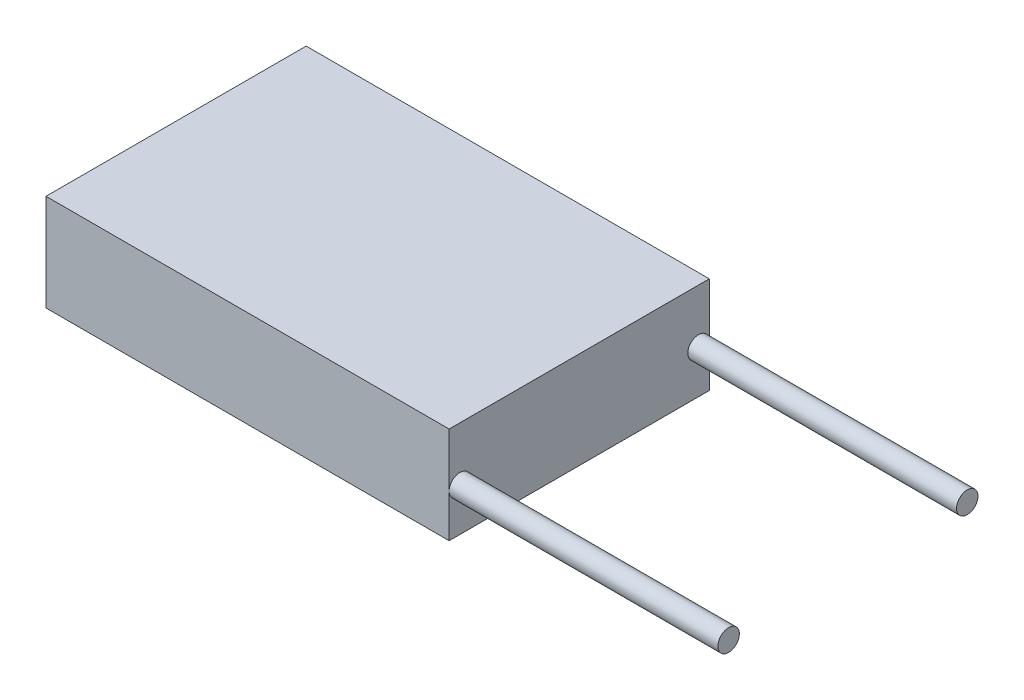
ISO-10303-21;
HEADER;
FILE_DESCRIPTION(('STEP AP214'),'2;1');
FILE_NAME('part.step','',(''),(''),'','','');
FILE_SCHEMA(('AUTOMOTIVE_DESIGN { 1 0 10303 214 1 1 1 1 }'));
ENDSEC;
DATA;
#1=APPLICATION_CONTEXT('core data for automotive mechanical design processes');
#2=APPLICATION_PROTOCOL_DEFINITION('international standard','automotive_design',2000,#1);
#3=PRODUCT_CONTEXT('',#1,'mechanical');
#4=PRODUCT('Part','Part','',(#3));
#5=PRODUCT_RELATED_PRODUCT_CATEGORY('part','',(#4));
#6=PRODUCT_DEFINITION_FORMATION('','',#4);
#7=PRODUCT_DEFINITION_CONTEXT('part definition',#1,'design');
#8=PRODUCT_DEFINITION('design','',#6,#7);
#9=PRODUCT_DEFINITION_SHAPE('','',#8);
#10=(LENGTH_UNIT() NAMED_UNIT(*) SI_UNIT(.MILLI.,.METRE.));
#11=(NAMED_UNIT(*) PLANE_ANGLE_UNIT() SI_UNIT($,.RADIAN.));
#12=(NAMED_UNIT(*) SI_UNIT($,.STERADIAN.) SOLID_ANGLE_UNIT());
#13=UNCERTAINTY_MEASURE_WITH_UNIT(LENGTH_MEASURE(1.E-05),#10,'distance_accuracy_value','');
#14=(GEOMETRIC_REPRESENTATION_CONTEXT(3) GLOBAL_UNCERTAINTY_ASSIGNED_CONTEXT((#13)) GLOBAL_UNIT_ASSIGNED_CONTEXT((#10,
#11,#12)) REPRESENTATION_CONTEXT('',''));
#15=CARTESIAN_POINT('',(0.,0.,0.));
#16=DIRECTION('',(0.,0.,1.));
#17=DIRECTION('',(1.,0.,0.));
#18=AXIS2_PLACEMENT_3D('',#15,#16,#17);
#19=CARTESIAN_POINT('',(18.75,9.,-12.1));
#20=DIRECTION('',(-1.,0.,0.));
#21=DIRECTION('',(0.,0.,1.));
#22=AXIS2_PLACEMENT_3D('',#19,#20,#21);
#23=PLANE('',#22);
#24=DIRECTION('',(0.,-1.,0.));
#25=VECTOR('',#24,1.);
#26=CARTESIAN_POINT('',(18.75,9.,-12.1));
#27=LINE('',#26,#25);
#28=CARTESIAN_POINT('',(18.75,4.,-12.1));
#29=VERTEX_POINT('',#28);
#30=CARTESIAN_POINT('',(18.75,0.,-12.1));
#31=VERTEX_POINT('',#30);
#32=EDGE_CURVE('E43',#29,#31,#27,.T.);
#33=ORIENTED_EDGE('',*,*,#32,.F.);
#34=CARTESIAN_POINT('',(18.75,4.,-11.1));
#35=DIRECTION('',(-1.,0.,0.));
#36=DIRECTION('',(0.,0.,1.));
#37=AXIS2_PLACEMENT_3D('',#34,#35,#36);
#38=CIRCLE('',#37,1.);
#39=EDGE_CURVE('E48',#29,#29,#38,.T.);
#40=ORIENTED_EDGE('',*,*,#39,.T.);
#41=CARTESIAN_POINT('',(18.75,9.,-12.1));
#42=VERTEX_POINT('',#41);
#43=EDGE_CURVE('E11',#42,#29,#27,.T.);
#44=ORIENTED_EDGE('',*,*,#43,.F.);
#45=DIRECTION('',(0.,0.,-1.));
#46=VECTOR('',#45,1.);
#47=CARTESIAN_POINT('',(18.75,9.,-12.1));
#48=LINE('',#47,#46);
#49=CARTESIAN_POINT('',(18.75,9.,12.1));
#50=VERTEX_POINT('',#49);
#51=EDGE_CURVE('E94',#50,#42,#48,.T.);
#52=ORIENTED_EDGE('',*,*,#51,.F.);
#53=DIRECTION('',(0.,-1.,0.));
#54=VECTOR('',#53,1.);
#55=CARTESIAN_POINT('',(18.75,9.,12.1));
#56=LINE('',#55,#54);
#57=CARTESIAN_POINT('',(18.75,4.,12.1));
#58=VERTEX_POINT('',#57);
#59=EDGE_CURVE('E89',#50,#58,#56,.T.);
#60=ORIENTED_EDGE('',*,*,#59,.T.);
#61=CARTESIAN_POINT('',(18.75,4.,11.1));
#62=DIRECTION('',(1.,0.,0.));
#63=DIRECTION('',(0.,0.,-1.));
#64=AXIS2_PLACEMENT_3D('',#61,#62,#63);
#65=CIRCLE('',#64,1.);
#66=EDGE_CURVE('E92',#58,#58,#65,.T.);
#67=ORIENTED_EDGE('',*,*,#66,.F.);
#68=CARTESIAN_POINT('',(18.75,0.,12.1));
#69=VERTEX_POINT('',#68);
#70=EDGE_CURVE('E78',#58,#69,#56,.T.);
#71=ORIENTED_EDGE('',*,*,#70,.T.);
#72=DIRECTION('',(0.,0.,-1.));
#73=VECTOR('',#72,1.);
#74=CARTESIAN_POINT('',(18.75,0.,-12.1));
#75=LINE('',#74,#73);
#76=EDGE_CURVE('E118',#69,#31,#75,.T.);
#77=ORIENTED_EDGE('',*,*,#76,.T.);
#78=EDGE_LOOP('',(#33,#40,#44,#52,#60,#67,#71,#77));
#79=FACE_BOUND('',#78,.T.);
#80=ADVANCED_FACE('F36',(#79),#23,.F.);
#81=CARTESIAN_POINT('',(-18.75,9.,-12.1));
#82=DIRECTION('',(0.,0.,1.));
#83=DIRECTION('',(1.,0.,0.));
#84=AXIS2_PLACEMENT_3D('',#81,#82,#83);
#85=PLANE('',#84);
#86=DIRECTION('',(-1.,0.,0.));
#87=VECTOR('',#86,1.);
#88=CARTESIAN_POINT('',(-18.75,0.,-12.1));
#89=LINE('',#88,#87);
#90=CARTESIAN_POINT('',(-18.75,0.,-12.1));
#91=VERTEX_POINT('',#90);
#92=EDGE_CURVE('E115',#31,#91,#89,.T.);
#93=ORIENTED_EDGE('',*,*,#92,.T.);
#94=DIRECTION('',(0.,-1.,0.));
#95=VECTOR('',#94,1.);
#96=CARTESIAN_POINT('',(-18.75,9.,-12.1));
#97=LINE('',#96,#95);
#98=CARTESIAN_POINT('',(-18.75,9.,-12.1));
#99=VERTEX_POINT('',#98);
#100=EDGE_CURVE('E108',#99,#91,#97,.T.);
#101=ORIENTED_EDGE('',*,*,#100,.F.);
#102=DIRECTION('',(-1.,0.,0.));
#103=VECTOR('',#102,1.);
#104=CARTESIAN_POINT('',(-18.75,9.,-12.1));
#105=LINE('',#104,#103);
#106=EDGE_CURVE('E85',#42,#99,#105,.T.);
#107=ORIENTED_EDGE('',*,*,#106,.F.);
#108=ORIENTED_EDGE('',*,*,#43,.T.);
#109=ORIENTED_EDGE('',*,*,#32,.T.);
#110=EDGE_LOOP('',(#93,#101,#107,#108,#109));
#111=FACE_BOUND('',#110,.T.);
#112=ADVANCED_FACE('F114',(#111),#85,.F.);
#113=CARTESIAN_POINT('',(-18.75,9.,-12.1));
#114=DIRECTION('',(1.,0.,0.));
#115=DIRECTION('',(0.,0.,-1.));
#116=AXIS2_PLACEMENT_3D('',#113,#114,#115);
#117=PLANE('',#116);
#118=DIRECTION('',(0.,0.,1.));
#119=VECTOR('',#118,1.);
#120=CARTESIAN_POINT('',(-18.75,0.,-12.1));
#121=LINE('',#120,#119);
#122=CARTESIAN_POINT('',(-18.75,0.,12.1));
#123=VERTEX_POINT('',#122);
#124=EDGE_CURVE('E119',#91,#123,#121,.T.);
#125=ORIENTED_EDGE('',*,*,#124,.T.);
#126=DIRECTION('',(0.,-1.,0.));
#127=VECTOR('',#126,1.);
#128=CARTESIAN_POINT('',(-18.75,9.,12.1));
#129=LINE('',#128,#127);
#130=CARTESIAN_POINT('',(-18.75,9.,12.1));
#131=VERTEX_POINT('',#130);
#132=EDGE_CURVE('E96',#131,#123,#129,.T.);
#133=ORIENTED_EDGE('',*,*,#132,.F.);
#134=DIRECTION('',(0.,0.,1.));
#135=VECTOR('',#134,1.);
#136=CARTESIAN_POINT('',(-18.75,9.,-12.1));
#137=LINE('',#136,#135);
#138=EDGE_CURVE('E103',#99,#131,#137,.T.);
#139=ORIENTED_EDGE('',*,*,#138,.F.);
#140=ORIENTED_EDGE('',*,*,#100,.T.);
#141=EDGE_LOOP('',(#125,#133,#139,#140));
#142=FACE_BOUND('',#141,.T.);
#143=ADVANCED_FACE('F131',(#142),#117,.F.);
#144=CARTESIAN_POINT('',(-18.75,9.,12.1));
#145=DIRECTION('',(0.,0.,-1.));
#146=DIRECTION('',(-1.,0.,0.));
#147=AXIS2_PLACEMENT_3D('',#144,#145,#146);
#148=PLANE('',#147);
#149=DIRECTION('',(1.,0.,0.));
#150=VECTOR('',#149,1.);
#151=CARTESIAN_POINT('',(-18.75,0.,12.1));
#152=LINE('',#151,#150);
#153=EDGE_CURVE('E101',#123,#69,#152,.T.);
#154=ORIENTED_EDGE('',*,*,#153,.T.);
#155=ORIENTED_EDGE('',*,*,#70,.F.);
#156=ORIENTED_EDGE('',*,*,#59,.F.);
#157=DIRECTION('',(1.,0.,0.));
#158=VECTOR('',#157,1.);
#159=CARTESIAN_POINT('',(-18.75,9.,12.1));
#160=LINE('',#159,#158);
#161=EDGE_CURVE('E56',#131,#50,#160,.T.);
#162=ORIENTED_EDGE('',*,*,#161,.F.);
#163=ORIENTED_EDGE('',*,*,#132,.T.);
#164=EDGE_LOOP('',(#154,#155,#156,#162,#163));
#165=FACE_BOUND('',#164,.T.);
#166=ADVANCED_FACE('F98',(#165),#148,.F.);
#167=CARTESIAN_POINT('',(0.,9.,0.));
#168=DIRECTION('',(0.,1.,0.));
#169=DIRECTION('',(0.,0.,1.));
#170=AXIS2_PLACEMENT_3D('',#167,#168,#169);
#171=PLANE('',#170);
#172=ORIENTED_EDGE('',*,*,#51,.T.);
#173=ORIENTED_EDGE('',*,*,#106,.T.);
#174=ORIENTED_EDGE('',*,*,#138,.T.);
#175=ORIENTED_EDGE('',*,*,#161,.T.);
#176=EDGE_LOOP('',(#172,#173,#174,#175));
#177=FACE_BOUND('',#176,.T.);
#178=ADVANCED_FACE('F130',(#177),#171,.T.);
#179=CARTESIAN_POINT('',(0.,0.,0.));
#180=DIRECTION('',(0.,1.,0.));
#181=DIRECTION('',(0.,0.,1.));
#182=AXIS2_PLACEMENT_3D('',#179,#180,#181);
#183=PLANE('',#182);
#184=ORIENTED_EDGE('',*,*,#76,.F.);
#185=ORIENTED_EDGE('',*,*,#153,.F.);
#186=ORIENTED_EDGE('',*,*,#124,.F.);
#187=ORIENTED_EDGE('',*,*,#92,.F.);
#188=EDGE_LOOP('',(#184,#185,#186,#187));
#189=FACE_BOUND('',#188,.T.);
#190=ADVANCED_FACE('F117',(#189),#183,.F.);
#191=CARTESIAN_POINT('',(43.75,4.,11.1));
#192=DIRECTION('',(-1.,0.,0.));
#193=DIRECTION('',(0.,0.,1.));
#194=AXIS2_PLACEMENT_3D('',#191,#192,#193);
#195=CYLINDRICAL_SURFACE('',#194,1.);
#196=CARTESIAN_POINT('',(43.75,4.,11.1));
#197=DIRECTION('',(1.,0.,0.));
#198=DIRECTION('',(0.,0.,-1.));
#199=AXIS2_PLACEMENT_3D('',#196,#197,#198);
#200=CIRCLE('',#199,1.);
#201=CARTESIAN_POINT('',(43.75,4.,10.1));
#202=VERTEX_POINT('',#201);
#203=EDGE_CURVE('E121',#202,#202,#200,.T.);
#204=ORIENTED_EDGE('',*,*,#203,.F.);
#205=EDGE_LOOP('',(#204));
#206=FACE_BOUND('',#205,.T.);
#207=ORIENTED_EDGE('',*,*,#66,.T.);
#208=EDGE_LOOP('',(#207));
#209=FACE_BOUND('',#208,.T.);
#210=ADVANCED_FACE('F164',(#206,#209),#195,.T.);
#211=CARTESIAN_POINT('',(43.75,4.,11.1));
#212=DIRECTION('',(1.,0.,0.));
#213=DIRECTION('',(0.,0.,-1.));
#214=AXIS2_PLACEMENT_3D('',#211,#212,#213);
#215=PLANE('',#214);
#216=ORIENTED_EDGE('',*,*,#203,.T.);
#217=EDGE_LOOP('',(#216));
#218=FACE_BOUND('',#217,.T.);
#219=ADVANCED_FACE('F180',(#218),#215,.T.);
#220=CARTESIAN_POINT('',(43.75,4.,-11.1));
#221=DIRECTION('',(-1.,0.,0.));
#222=DIRECTION('',(0.,0.,1.));
#223=AXIS2_PLACEMENT_3D('',#220,#221,#222);
#224=CYLINDRICAL_SURFACE('',#223,1.);
#225=CARTESIAN_POINT('',(43.75,4.,-11.1));
#226=DIRECTION('',(-1.,0.,0.));
#227=DIRECTION('',(0.,0.,1.));
#228=AXIS2_PLACEMENT_3D('',#225,#226,#227);
#229=CIRCLE('',#228,1.);
#230=CARTESIAN_POINT('',(43.75,4.,-10.1));
#231=VERTEX_POINT('',#230);
#232=EDGE_CURVE('E196',#231,#231,#229,.T.);
#233=ORIENTED_EDGE('',*,*,#232,.T.);
#234=EDGE_LOOP('',(#233));
#235=FACE_BOUND('',#234,.T.);
#236=ORIENTED_EDGE('',*,*,#39,.F.);
#237=EDGE_LOOP('',(#236));
#238=FACE_BOUND('',#237,.T.);
#239=ADVANCED_FACE('F184',(#235,#238),#224,.T.);
#240=CARTESIAN_POINT('',(43.75,4.,-11.1));
#241=DIRECTION('',(1.,0.,0.));
#242=DIRECTION('',(0.,0.,1.));
#243=AXIS2_PLACEMENT_3D('',#240,#241,#242);
#244=PLANE('',#243);
#245=ORIENTED_EDGE('',*,*,#232,.F.);
#246=EDGE_LOOP('',(#245));
#247=FACE_BOUND('',#246,.T.);
#248=ADVANCED_FACE('F188',(#247),#244,.T.);
#249=CLOSED_SHELL('',(#80,#112,#143,#166,#178,#190,#210,#219,#239,#248));
#250=MANIFOLD_SOLID_BREP('B2',#249);
#251=ADVANCED_BREP_SHAPE_REPRESENTATION('',(#18,#250),#14);
#252=SHAPE_DEFINITION_REPRESENTATION(#9,#251);
ENDSEC;
END-ISO-10303-21;
